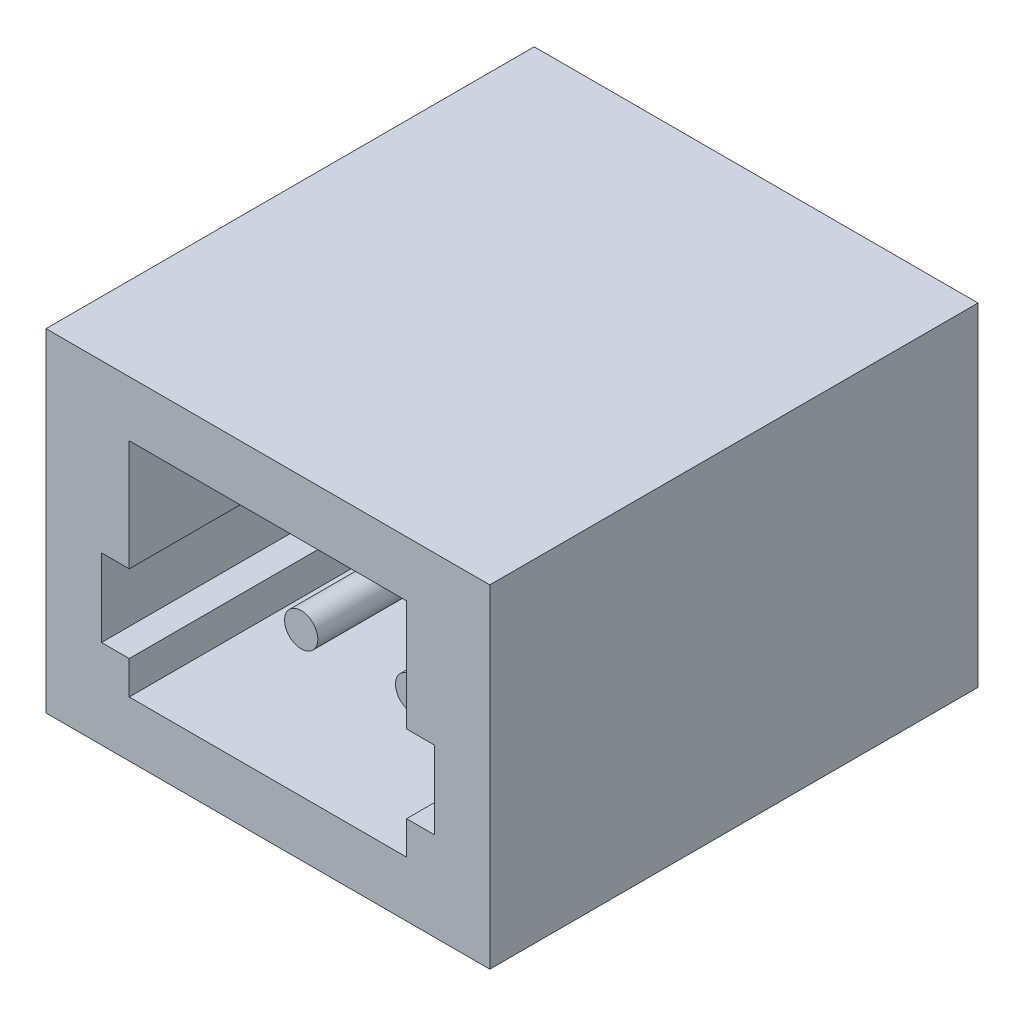
ISO-10303-21;
HEADER;
FILE_DESCRIPTION(('STEP AP214'),'2;1');
FILE_NAME('part.step','',(''),(''),'','','');
FILE_SCHEMA(('AUTOMOTIVE_DESIGN { 1 0 10303 214 1 1 1 1 }'));
ENDSEC;
DATA;
#1=APPLICATION_CONTEXT('core data for automotive mechanical design processes');
#2=APPLICATION_PROTOCOL_DEFINITION('international standard','automotive_design',2000,#1);
#3=PRODUCT_CONTEXT('',#1,'mechanical');
#4=PRODUCT('Part','Part','',(#3));
#5=PRODUCT_RELATED_PRODUCT_CATEGORY('part','',(#4));
#6=PRODUCT_DEFINITION_FORMATION('','',#4);
#7=PRODUCT_DEFINITION_CONTEXT('part definition',#1,'design');
#8=PRODUCT_DEFINITION('design','',#6,#7);
#9=PRODUCT_DEFINITION_SHAPE('','',#8);
#10=(LENGTH_UNIT() NAMED_UNIT(*) SI_UNIT(.MILLI.,.METRE.));
#11=(NAMED_UNIT(*) PLANE_ANGLE_UNIT() SI_UNIT($,.RADIAN.));
#12=(NAMED_UNIT(*) SI_UNIT($,.STERADIAN.) SOLID_ANGLE_UNIT());
#13=UNCERTAINTY_MEASURE_WITH_UNIT(LENGTH_MEASURE(1.E-05),#10,'distance_accuracy_value','');
#14=(GEOMETRIC_REPRESENTATION_CONTEXT(3) GLOBAL_UNCERTAINTY_ASSIGNED_CONTEXT((#13)) GLOBAL_UNIT_ASSIGNED_CONTEXT((#10,
#11,#12)) REPRESENTATION_CONTEXT('',''));
#15=CARTESIAN_POINT('',(0.,0.,0.));
#16=DIRECTION('',(0.,0.,1.));
#17=DIRECTION('',(1.,0.,0.));
#18=AXIS2_PLACEMENT_3D('',#15,#16,#17);
#19=CARTESIAN_POINT('',(48.87919066397,14.25110304722,-10.15));
#20=DIRECTION('',(1.,0.,0.));
#21=DIRECTION('',(0.,0.,-1.));
#22=AXIS2_PLACEMENT_3D('',#19,#20,#21);
#23=PLANE('',#22);
#24=DIRECTION('',(0.,-1.,0.));
#25=VECTOR('',#24,1.);
#26=CARTESIAN_POINT('',(48.87919066397,14.25110304722,-5.75));
#27=LINE('',#26,#25);
#28=CARTESIAN_POINT('',(48.87919066397,14.25110304722,-5.75));
#29=VERTEX_POINT('',#28);
#30=CARTESIAN_POINT('',(48.87919066397,11.25110304722,-5.75));
#31=VERTEX_POINT('',#30);
#32=EDGE_CURVE('E11',#29,#31,#27,.T.);
#33=ORIENTED_EDGE('',*,*,#32,.T.);
#34=DIRECTION('',(0.,0.,-1.));
#35=VECTOR('',#34,1.);
#36=CARTESIAN_POINT('',(48.87919066397,11.25110304722,-5.75));
#37=LINE('',#36,#35);
#38=CARTESIAN_POINT('',(48.87919066397,11.25110304722,-10.15));
#39=VERTEX_POINT('',#38);
#40=EDGE_CURVE('E27',#31,#39,#37,.T.);
#41=ORIENTED_EDGE('',*,*,#40,.T.);
#42=DIRECTION('',(0.,-1.,0.));
#43=VECTOR('',#42,1.);
#44=CARTESIAN_POINT('',(48.87919066397,14.25110304722,-10.15));
#45=LINE('',#44,#43);
#46=CARTESIAN_POINT('',(48.87919066397,14.25110304722,-10.15));
#47=VERTEX_POINT('',#46);
#48=EDGE_CURVE('E430',#47,#39,#45,.T.);
#49=ORIENTED_EDGE('',*,*,#48,.F.);
#50=DIRECTION('',(0.,0.,-1.));
#51=VECTOR('',#50,1.);
#52=CARTESIAN_POINT('',(48.87919066397,14.25110304722,-5.75));
#53=LINE('',#52,#51);
#54=EDGE_CURVE('E498',#29,#47,#53,.T.);
#55=ORIENTED_EDGE('',*,*,#54,.F.);
#56=EDGE_LOOP('',(#33,#41,#49,#55));
#57=FACE_BOUND('',#56,.T.);
#58=ADVANCED_FACE('F17',(#57),#23,.T.);
#59=CARTESIAN_POINT('',(44.87919066397,14.25110304722,-10.15));
#60=DIRECTION('',(0.,1.,0.));
#61=DIRECTION('',(0.,0.,1.));
#62=AXIS2_PLACEMENT_3D('',#59,#60,#61);
#63=PLANE('',#62);
#64=ORIENTED_EDGE('',*,*,#54,.T.);
#65=DIRECTION('',(1.,0.,0.));
#66=VECTOR('',#65,1.);
#67=CARTESIAN_POINT('',(44.87919066397,14.25110304722,-10.15));
#68=LINE('',#67,#66);
#69=CARTESIAN_POINT('',(44.87919066397,14.25110304722,-10.15));
#70=VERTEX_POINT('',#69);
#71=EDGE_CURVE('E427',#70,#47,#68,.T.);
#72=ORIENTED_EDGE('',*,*,#71,.F.);
#73=DIRECTION('',(0.,0.,-1.));
#74=VECTOR('',#73,1.);
#75=CARTESIAN_POINT('',(44.87919066397,14.25110304722,-5.75));
#76=LINE('',#75,#74);
#77=CARTESIAN_POINT('',(44.87919066397,14.25110304722,-5.75));
#78=VERTEX_POINT('',#77);
#79=EDGE_CURVE('E494',#78,#70,#76,.T.);
#80=ORIENTED_EDGE('',*,*,#79,.F.);
#81=DIRECTION('',(1.,0.,0.));
#82=VECTOR('',#81,1.);
#83=CARTESIAN_POINT('',(44.87919066397,14.25110304722,-5.75));
#84=LINE('',#83,#82);
#85=EDGE_CURVE('E493',#78,#29,#84,.T.);
#86=ORIENTED_EDGE('',*,*,#85,.T.);
#87=EDGE_LOOP('',(#64,#72,#80,#86));
#88=FACE_BOUND('',#87,.T.);
#89=ADVANCED_FACE('F188',(#88),#63,.T.);
#90=CARTESIAN_POINT('',(49.99345093786,14.29155013054,-5.75));
#91=DIRECTION('',(0.,0.,1.));
#92=DIRECTION('',(1.,0.,0.));
#93=AXIS2_PLACEMENT_3D('',#90,#91,#92);
#94=PLANE('',#93);
#95=DIRECTION('',(-1.,0.,0.));
#96=VECTOR('',#95,1.);
#97=CARTESIAN_POINT('',(48.87919066397,11.25110304722,-5.75));
#98=LINE('',#97,#96);
#99=CARTESIAN_POINT('',(44.87919066397,11.25110304722,-5.75));
#100=VERTEX_POINT('',#99);
#101=EDGE_CURVE('E426',#31,#100,#98,.T.);
#102=ORIENTED_EDGE('',*,*,#101,.F.);
#103=ORIENTED_EDGE('',*,*,#32,.F.);
#104=ORIENTED_EDGE('',*,*,#85,.F.);
#105=DIRECTION('',(0.,1.,0.));
#106=VECTOR('',#105,1.);
#107=CARTESIAN_POINT('',(44.87919066397,11.25110304722,-5.75));
#108=LINE('',#107,#106);
#109=EDGE_CURVE('E490',#100,#78,#108,.T.);
#110=ORIENTED_EDGE('',*,*,#109,.F.);
#111=EDGE_LOOP('',(#102,#103,#104,#110));
#112=FACE_BOUND('',#111,.T.);
#113=DIRECTION('',(-1.,0.,0.));
#114=VECTOR('',#113,1.);
#115=CARTESIAN_POINT('',(48.12919066397,13.75110304722,-5.75));
#116=LINE('',#115,#114);
#117=CARTESIAN_POINT('',(48.12919066397,13.75110304722,-5.75));
#118=VERTEX_POINT('',#117);
#119=CARTESIAN_POINT('',(45.62919066397,13.75110304722,-5.75));
#120=VERTEX_POINT('',#119);
#121=EDGE_CURVE('E436',#118,#120,#116,.T.);
#122=ORIENTED_EDGE('',*,*,#121,.F.);
#123=DIRECTION('',(0.,1.,0.));
#124=VECTOR('',#123,1.);
#125=CARTESIAN_POINT('',(48.12919066397,12.75110304722,-5.75));
#126=LINE('',#125,#124);
#127=CARTESIAN_POINT('',(48.12919066397,12.75110304722,-5.75));
#128=VERTEX_POINT('',#127);
#129=EDGE_CURVE('E442',#128,#118,#126,.T.);
#130=ORIENTED_EDGE('',*,*,#129,.F.);
#131=DIRECTION('',(-1.,0.,0.));
#132=VECTOR('',#131,1.);
#133=CARTESIAN_POINT('',(48.37919066397,12.75110304722,-5.75));
#134=LINE('',#133,#132);
#135=CARTESIAN_POINT('',(48.37919066397,12.75110304722,-5.75));
#136=VERTEX_POINT('',#135);
#137=EDGE_CURVE('E449',#136,#128,#134,.T.);
#138=ORIENTED_EDGE('',*,*,#137,.F.);
#139=DIRECTION('',(0.,1.,0.));
#140=VECTOR('',#139,1.);
#141=CARTESIAN_POINT('',(48.37919066397,12.05110304722,-5.75));
#142=LINE('',#141,#140);
#143=CARTESIAN_POINT('',(48.37919066397,12.05110304722,-5.75));
#144=VERTEX_POINT('',#143);
#145=EDGE_CURVE('E456',#144,#136,#142,.T.);
#146=ORIENTED_EDGE('',*,*,#145,.F.);
#147=DIRECTION('',(1.,0.,0.));
#148=VECTOR('',#147,1.);
#149=CARTESIAN_POINT('',(48.12919066397,12.05110304722,-5.75));
#150=LINE('',#149,#148);
#151=CARTESIAN_POINT('',(48.12919066397,12.05110304722,-5.75));
#152=VERTEX_POINT('',#151);
#153=EDGE_CURVE('E463',#152,#144,#150,.T.);
#154=ORIENTED_EDGE('',*,*,#153,.F.);
#155=DIRECTION('',(0.,1.,0.));
#156=VECTOR('',#155,1.);
#157=CARTESIAN_POINT('',(48.12919066397,11.75110304722,-5.75));
#158=LINE('',#157,#156);
#159=CARTESIAN_POINT('',(48.12919066397,11.75110304722,-5.75));
#160=VERTEX_POINT('',#159);
#161=EDGE_CURVE('E470',#160,#152,#158,.T.);
#162=ORIENTED_EDGE('',*,*,#161,.F.);
#163=DIRECTION('',(1.,0.,0.));
#164=VECTOR('',#163,1.);
#165=CARTESIAN_POINT('',(45.62919066397,11.75110304722,-5.75));
#166=LINE('',#165,#164);
#167=CARTESIAN_POINT('',(45.62919066397,11.75110304722,-5.75));
#168=VERTEX_POINT('',#167);
#169=EDGE_CURVE('E476',#168,#160,#166,.T.);
#170=ORIENTED_EDGE('',*,*,#169,.F.);
#171=DIRECTION('',(0.,-1.,0.));
#172=VECTOR('',#171,1.);
#173=CARTESIAN_POINT('',(45.62919066397,12.05110304722,-5.75));
#174=LINE('',#173,#172);
#175=CARTESIAN_POINT('',(45.62919066397,12.05110304722,-5.75));
#176=VERTEX_POINT('',#175);
#177=EDGE_CURVE('E401',#176,#168,#174,.T.);
#178=ORIENTED_EDGE('',*,*,#177,.F.);
#179=DIRECTION('',(1.,0.,0.));
#180=VECTOR('',#179,1.);
#181=CARTESIAN_POINT('',(45.37919066397,12.05110304722,-5.75));
#182=LINE('',#181,#180);
#183=CARTESIAN_POINT('',(45.37919066397,12.05110304722,-5.75));
#184=VERTEX_POINT('',#183);
#185=EDGE_CURVE('E399',#184,#176,#182,.T.);
#186=ORIENTED_EDGE('',*,*,#185,.F.);
#187=DIRECTION('',(0.,-1.,0.));
#188=VECTOR('',#187,1.);
#189=CARTESIAN_POINT('',(45.37919066397,12.75110304722,-5.75));
#190=LINE('',#189,#188);
#191=CARTESIAN_POINT('',(45.37919066397,12.75110304722,-5.75));
#192=VERTEX_POINT('',#191);
#193=EDGE_CURVE('E147',#192,#184,#190,.T.);
#194=ORIENTED_EDGE('',*,*,#193,.F.);
#195=DIRECTION('',(-1.,0.,0.));
#196=VECTOR('',#195,1.);
#197=CARTESIAN_POINT('',(45.62919066397,12.75110304722,-5.75));
#198=LINE('',#197,#196);
#199=CARTESIAN_POINT('',(45.62919066397,12.75110304722,-5.75));
#200=VERTEX_POINT('',#199);
#201=EDGE_CURVE('E145',#200,#192,#198,.T.);
#202=ORIENTED_EDGE('',*,*,#201,.F.);
#203=DIRECTION('',(0.,-1.,0.));
#204=VECTOR('',#203,1.);
#205=CARTESIAN_POINT('',(45.62919066397,13.75110304722,-5.75));
#206=LINE('',#205,#204);
#207=EDGE_CURVE('E414',#120,#200,#206,.T.);
#208=ORIENTED_EDGE('',*,*,#207,.F.);
#209=EDGE_LOOP('',(#122,#130,#138,#146,#154,#162,#170,#178,#186,#194,#202,#208));
#210=FACE_BOUND('',#209,.T.);
#211=ADVANCED_FACE('F194',(#112,#210),#94,.T.);
#212=CARTESIAN_POINT('',(44.87919066397,11.29638630085,-10.15));
#213=DIRECTION('',(-1.,0.,0.));
#214=DIRECTION('',(0.,0.,1.));
#215=AXIS2_PLACEMENT_3D('',#212,#213,#214);
#216=PLANE('',#215);
#217=ORIENTED_EDGE('',*,*,#109,.T.);
#218=ORIENTED_EDGE('',*,*,#79,.T.);
#219=DIRECTION('',(0.,1.,0.));
#220=VECTOR('',#219,1.);
#221=CARTESIAN_POINT('',(44.87919066397,11.25110304722,-10.15));
#222=LINE('',#221,#220);
#223=CARTESIAN_POINT('',(44.87919066397,11.25110304722,-10.15));
#224=VERTEX_POINT('',#223);
#225=EDGE_CURVE('E419',#224,#70,#222,.T.);
#226=ORIENTED_EDGE('',*,*,#225,.F.);
#227=DIRECTION('',(0.,0.,-1.));
#228=VECTOR('',#227,1.);
#229=CARTESIAN_POINT('',(44.87919066397,11.25110304722,-5.75));
#230=LINE('',#229,#228);
#231=EDGE_CURVE('E423',#100,#224,#230,.T.);
#232=ORIENTED_EDGE('',*,*,#231,.F.);
#233=EDGE_LOOP('',(#217,#218,#226,#232));
#234=FACE_BOUND('',#233,.T.);
#235=ADVANCED_FACE('F200',(#234),#216,.T.);
#236=CARTESIAN_POINT('',(48.92156706221,11.25110304722,-10.15));
#237=DIRECTION('',(0.,-1.,0.));
#238=DIRECTION('',(0.,0.,-1.));
#239=AXIS2_PLACEMENT_3D('',#236,#237,#238);
#240=PLANE('',#239);
#241=ORIENTED_EDGE('',*,*,#101,.T.);
#242=ORIENTED_EDGE('',*,*,#231,.T.);
#243=DIRECTION('',(-1.,0.,0.));
#244=VECTOR('',#243,1.);
#245=CARTESIAN_POINT('',(48.87919066397,11.25110304722,-10.15));
#246=LINE('',#245,#244);
#247=EDGE_CURVE('E422',#39,#224,#246,.T.);
#248=ORIENTED_EDGE('',*,*,#247,.F.);
#249=ORIENTED_EDGE('',*,*,#40,.F.);
#250=EDGE_LOOP('',(#241,#242,#248,#249));
#251=FACE_BOUND('',#250,.T.);
#252=ADVANCED_FACE('F204',(#251),#240,.T.);
#253=CARTESIAN_POINT('',(49.99345093786,14.29155013054,-10.15));
#254=DIRECTION('',(0.,0.,1.));
#255=DIRECTION('',(1.,0.,0.));
#256=AXIS2_PLACEMENT_3D('',#253,#254,#255);
#257=PLANE('',#256);
#258=ORIENTED_EDGE('',*,*,#71,.T.);
#259=ORIENTED_EDGE('',*,*,#48,.T.);
#260=ORIENTED_EDGE('',*,*,#247,.T.);
#261=ORIENTED_EDGE('',*,*,#225,.T.);
#262=EDGE_LOOP('',(#258,#259,#260,#261));
#263=FACE_BOUND('',#262,.T.);
#264=ADVANCED_FACE('F208',(#263),#257,.F.);
#265=CARTESIAN_POINT('',(45.62919066397,13.75110304722,-5.75));
#266=DIRECTION('',(-1.,0.,0.));
#267=DIRECTION('',(0.,-1.,0.));
#268=AXIS2_PLACEMENT_3D('',#265,#266,#267);
#269=PLANE('',#268);
#270=DIRECTION('',(0.,0.,-1.));
#271=VECTOR('',#270,1.);
#272=CARTESIAN_POINT('',(45.62919066397,12.75110304722,-5.75));
#273=LINE('',#272,#271);
#274=CARTESIAN_POINT('',(45.62919066397,12.75110304722,-9.35));
#275=VERTEX_POINT('',#274);
#276=EDGE_CURVE('E417',#200,#275,#273,.T.);
#277=ORIENTED_EDGE('',*,*,#276,.T.);
#278=DIRECTION('',(0.,-1.,0.));
#279=VECTOR('',#278,1.);
#280=CARTESIAN_POINT('',(45.62919066397,13.75110304722,-9.35));
#281=LINE('',#280,#279);
#282=CARTESIAN_POINT('',(45.62919066397,13.75110304722,-9.35));
#283=VERTEX_POINT('',#282);
#284=EDGE_CURVE('E152',#283,#275,#281,.T.);
#285=ORIENTED_EDGE('',*,*,#284,.F.);
#286=DIRECTION('',(0.,0.,-1.));
#287=VECTOR('',#286,1.);
#288=CARTESIAN_POINT('',(45.62919066397,13.75110304722,-5.75));
#289=LINE('',#288,#287);
#290=EDGE_CURVE('E418',#120,#283,#289,.T.);
#291=ORIENTED_EDGE('',*,*,#290,.F.);
#292=ORIENTED_EDGE('',*,*,#207,.T.);
#293=EDGE_LOOP('',(#277,#285,#291,#292));
#294=FACE_BOUND('',#293,.T.);
#295=ADVANCED_FACE('F211',(#294),#269,.F.);
#296=CARTESIAN_POINT('',(48.12919066397,13.75110304722,-5.75));
#297=DIRECTION('',(0.,1.,0.));
#298=DIRECTION('',(-1.,0.,0.));
#299=AXIS2_PLACEMENT_3D('',#296,#297,#298);
#300=PLANE('',#299);
#301=ORIENTED_EDGE('',*,*,#290,.T.);
#302=DIRECTION('',(-1.,0.,0.));
#303=VECTOR('',#302,1.);
#304=CARTESIAN_POINT('',(48.12919066397,13.75110304722,-9.35));
#305=LINE('',#304,#303);
#306=CARTESIAN_POINT('',(48.12919066397,13.75110304722,-9.35));
#307=VERTEX_POINT('',#306);
#308=EDGE_CURVE('E433',#307,#283,#305,.T.);
#309=ORIENTED_EDGE('',*,*,#308,.F.);
#310=DIRECTION('',(0.,0.,-1.));
#311=VECTOR('',#310,1.);
#312=CARTESIAN_POINT('',(48.12919066397,13.75110304722,-5.75));
#313=LINE('',#312,#311);
#314=EDGE_CURVE('E439',#118,#307,#313,.T.);
#315=ORIENTED_EDGE('',*,*,#314,.F.);
#316=ORIENTED_EDGE('',*,*,#121,.T.);
#317=EDGE_LOOP('',(#301,#309,#315,#316));
#318=FACE_BOUND('',#317,.T.);
#319=ADVANCED_FACE('F215',(#318),#300,.F.);
#320=CARTESIAN_POINT('',(48.12919066397,12.75110304722,-5.75));
#321=DIRECTION('',(1.,0.,0.));
#322=DIRECTION('',(0.,1.,0.));
#323=AXIS2_PLACEMENT_3D('',#320,#321,#322);
#324=PLANE('',#323);
#325=ORIENTED_EDGE('',*,*,#314,.T.);
#326=DIRECTION('',(0.,1.,0.));
#327=VECTOR('',#326,1.);
#328=CARTESIAN_POINT('',(48.12919066397,12.75110304722,-9.35));
#329=LINE('',#328,#327);
#330=CARTESIAN_POINT('',(48.12919066397,12.75110304722,-9.35));
#331=VERTEX_POINT('',#330);
#332=EDGE_CURVE('E438',#331,#307,#329,.T.);
#333=ORIENTED_EDGE('',*,*,#332,.F.);
#334=DIRECTION('',(0.,0.,-1.));
#335=VECTOR('',#334,1.);
#336=CARTESIAN_POINT('',(48.12919066397,12.75110304722,-5.75));
#337=LINE('',#336,#335);
#338=EDGE_CURVE('E446',#128,#331,#337,.T.);
#339=ORIENTED_EDGE('',*,*,#338,.F.);
#340=ORIENTED_EDGE('',*,*,#129,.T.);
#341=EDGE_LOOP('',(#325,#333,#339,#340));
#342=FACE_BOUND('',#341,.T.);
#343=ADVANCED_FACE('F219',(#342),#324,.F.);
#344=CARTESIAN_POINT('',(48.37919066397,12.75110304722,-5.75));
#345=DIRECTION('',(0.,1.,0.));
#346=DIRECTION('',(-1.,0.,0.));
#347=AXIS2_PLACEMENT_3D('',#344,#345,#346);
#348=PLANE('',#347);
#349=ORIENTED_EDGE('',*,*,#338,.T.);
#350=DIRECTION('',(-1.,0.,0.));
#351=VECTOR('',#350,1.);
#352=CARTESIAN_POINT('',(48.37919066397,12.75110304722,-9.35));
#353=LINE('',#352,#351);
#354=CARTESIAN_POINT('',(48.37919066397,12.75110304722,-9.35));
#355=VERTEX_POINT('',#354);
#356=EDGE_CURVE('E445',#355,#331,#353,.T.);
#357=ORIENTED_EDGE('',*,*,#356,.F.);
#358=DIRECTION('',(0.,0.,-1.));
#359=VECTOR('',#358,1.);
#360=CARTESIAN_POINT('',(48.37919066397,12.75110304722,-5.75));
#361=LINE('',#360,#359);
#362=EDGE_CURVE('E453',#136,#355,#361,.T.);
#363=ORIENTED_EDGE('',*,*,#362,.F.);
#364=ORIENTED_EDGE('',*,*,#137,.T.);
#365=EDGE_LOOP('',(#349,#357,#363,#364));
#366=FACE_BOUND('',#365,.T.);
#367=ADVANCED_FACE('F223',(#366),#348,.F.);
#368=CARTESIAN_POINT('',(48.37919066397,12.05110304722,-5.75));
#369=DIRECTION('',(1.,0.,0.));
#370=DIRECTION('',(0.,1.,0.));
#371=AXIS2_PLACEMENT_3D('',#368,#369,#370);
#372=PLANE('',#371);
#373=ORIENTED_EDGE('',*,*,#362,.T.);
#374=DIRECTION('',(0.,1.,0.));
#375=VECTOR('',#374,1.);
#376=CARTESIAN_POINT('',(48.37919066397,12.05110304722,-9.35));
#377=LINE('',#376,#375);
#378=CARTESIAN_POINT('',(48.37919066397,12.05110304722,-9.35));
#379=VERTEX_POINT('',#378);
#380=EDGE_CURVE('E452',#379,#355,#377,.T.);
#381=ORIENTED_EDGE('',*,*,#380,.F.);
#382=DIRECTION('',(0.,0.,-1.));
#383=VECTOR('',#382,1.);
#384=CARTESIAN_POINT('',(48.37919066397,12.05110304722,-5.75));
#385=LINE('',#384,#383);
#386=EDGE_CURVE('E460',#144,#379,#385,.T.);
#387=ORIENTED_EDGE('',*,*,#386,.F.);
#388=ORIENTED_EDGE('',*,*,#145,.T.);
#389=EDGE_LOOP('',(#373,#381,#387,#388));
#390=FACE_BOUND('',#389,.T.);
#391=ADVANCED_FACE('F227',(#390),#372,.F.);
#392=CARTESIAN_POINT('',(48.12919066397,12.05110304722,-5.75));
#393=DIRECTION('',(0.,-1.,0.));
#394=DIRECTION('',(1.,0.,0.));
#395=AXIS2_PLACEMENT_3D('',#392,#393,#394);
#396=PLANE('',#395);
#397=ORIENTED_EDGE('',*,*,#386,.T.);
#398=DIRECTION('',(1.,0.,0.));
#399=VECTOR('',#398,1.);
#400=CARTESIAN_POINT('',(48.12919066397,12.05110304722,-9.35));
#401=LINE('',#400,#399);
#402=CARTESIAN_POINT('',(48.12919066397,12.05110304722,-9.35));
#403=VERTEX_POINT('',#402);
#404=EDGE_CURVE('E459',#403,#379,#401,.T.);
#405=ORIENTED_EDGE('',*,*,#404,.F.);
#406=DIRECTION('',(0.,0.,-1.));
#407=VECTOR('',#406,1.);
#408=CARTESIAN_POINT('',(48.12919066397,12.05110304722,-5.75));
#409=LINE('',#408,#407);
#410=EDGE_CURVE('E467',#152,#403,#409,.T.);
#411=ORIENTED_EDGE('',*,*,#410,.F.);
#412=ORIENTED_EDGE('',*,*,#153,.T.);
#413=EDGE_LOOP('',(#397,#405,#411,#412));
#414=FACE_BOUND('',#413,.T.);
#415=ADVANCED_FACE('F231',(#414),#396,.F.);
#416=CARTESIAN_POINT('',(48.12919066397,11.75110304722,-5.75));
#417=DIRECTION('',(1.,0.,0.));
#418=DIRECTION('',(0.,1.,0.));
#419=AXIS2_PLACEMENT_3D('',#416,#417,#418);
#420=PLANE('',#419);
#421=ORIENTED_EDGE('',*,*,#410,.T.);
#422=DIRECTION('',(0.,1.,0.));
#423=VECTOR('',#422,1.);
#424=CARTESIAN_POINT('',(48.12919066397,11.75110304722,-9.35));
#425=LINE('',#424,#423);
#426=CARTESIAN_POINT('',(48.12919066397,11.75110304722,-9.35));
#427=VERTEX_POINT('',#426);
#428=EDGE_CURVE('E466',#427,#403,#425,.T.);
#429=ORIENTED_EDGE('',*,*,#428,.F.);
#430=DIRECTION('',(0.,0.,-1.));
#431=VECTOR('',#430,1.);
#432=CARTESIAN_POINT('',(48.12919066397,11.75110304722,-5.75));
#433=LINE('',#432,#431);
#434=EDGE_CURVE('E473',#160,#427,#433,.T.);
#435=ORIENTED_EDGE('',*,*,#434,.F.);
#436=ORIENTED_EDGE('',*,*,#161,.T.);
#437=EDGE_LOOP('',(#421,#429,#435,#436));
#438=FACE_BOUND('',#437,.T.);
#439=ADVANCED_FACE('F235',(#438),#420,.F.);
#440=CARTESIAN_POINT('',(45.62919066397,11.75110304722,-5.75));
#441=DIRECTION('',(0.,-1.,0.));
#442=DIRECTION('',(1.,0.,0.));
#443=AXIS2_PLACEMENT_3D('',#440,#441,#442);
#444=PLANE('',#443);
#445=ORIENTED_EDGE('',*,*,#434,.T.);
#446=DIRECTION('',(1.,0.,0.));
#447=VECTOR('',#446,1.);
#448=CARTESIAN_POINT('',(45.62919066397,11.75110304722,-9.35));
#449=LINE('',#448,#447);
#450=CARTESIAN_POINT('',(45.62919066397,11.75110304722,-9.35));
#451=VERTEX_POINT('',#450);
#452=EDGE_CURVE('E407',#451,#427,#449,.T.);
#453=ORIENTED_EDGE('',*,*,#452,.F.);
#454=DIRECTION('',(0.,0.,-1.));
#455=VECTOR('',#454,1.);
#456=CARTESIAN_POINT('',(45.62919066397,11.75110304722,-5.75));
#457=LINE('',#456,#455);
#458=EDGE_CURVE('E478',#168,#451,#457,.T.);
#459=ORIENTED_EDGE('',*,*,#458,.F.);
#460=ORIENTED_EDGE('',*,*,#169,.T.);
#461=EDGE_LOOP('',(#445,#453,#459,#460));
#462=FACE_BOUND('',#461,.T.);
#463=ADVANCED_FACE('F239',(#462),#444,.F.);
#464=CARTESIAN_POINT('',(45.62919066397,12.05110304722,-5.75));
#465=DIRECTION('',(-1.,0.,0.));
#466=DIRECTION('',(0.,-1.,0.));
#467=AXIS2_PLACEMENT_3D('',#464,#465,#466);
#468=PLANE('',#467);
#469=ORIENTED_EDGE('',*,*,#458,.T.);
#470=DIRECTION('',(0.,-1.,0.));
#471=VECTOR('',#470,1.);
#472=CARTESIAN_POINT('',(45.62919066397,12.05110304722,-9.35));
#473=LINE('',#472,#471);
#474=CARTESIAN_POINT('',(45.62919066397,12.05110304722,-9.35));
#475=VERTEX_POINT('',#474);
#476=EDGE_CURVE('E405',#475,#451,#473,.T.);
#477=ORIENTED_EDGE('',*,*,#476,.F.);
#478=DIRECTION('',(0.,0.,-1.));
#479=VECTOR('',#478,1.);
#480=CARTESIAN_POINT('',(45.62919066397,12.05110304722,-5.75));
#481=LINE('',#480,#479);
#482=EDGE_CURVE('E397',#176,#475,#481,.T.);
#483=ORIENTED_EDGE('',*,*,#482,.F.);
#484=ORIENTED_EDGE('',*,*,#177,.T.);
#485=EDGE_LOOP('',(#469,#477,#483,#484));
#486=FACE_BOUND('',#485,.T.);
#487=ADVANCED_FACE('F243',(#486),#468,.F.);
#488=CARTESIAN_POINT('',(45.37919066397,12.05110304722,-5.75));
#489=DIRECTION('',(0.,-1.,0.));
#490=DIRECTION('',(1.,0.,0.));
#491=AXIS2_PLACEMENT_3D('',#488,#489,#490);
#492=PLANE('',#491);
#493=ORIENTED_EDGE('',*,*,#482,.T.);
#494=DIRECTION('',(1.,0.,0.));
#495=VECTOR('',#494,1.);
#496=CARTESIAN_POINT('',(45.37919066397,12.05110304722,-9.35));
#497=LINE('',#496,#495);
#498=CARTESIAN_POINT('',(45.37919066397,12.05110304722,-9.35));
#499=VERTEX_POINT('',#498);
#500=EDGE_CURVE('E126',#499,#475,#497,.T.);
#501=ORIENTED_EDGE('',*,*,#500,.F.);
#502=DIRECTION('',(0.,0.,-1.));
#503=VECTOR('',#502,1.);
#504=CARTESIAN_POINT('',(45.37919066397,12.05110304722,-5.75));
#505=LINE('',#504,#503);
#506=EDGE_CURVE('E136',#184,#499,#505,.T.);
#507=ORIENTED_EDGE('',*,*,#506,.F.);
#508=ORIENTED_EDGE('',*,*,#185,.T.);
#509=EDGE_LOOP('',(#493,#501,#507,#508));
#510=FACE_BOUND('',#509,.T.);
#511=ADVANCED_FACE('F247',(#510),#492,.F.);
#512=CARTESIAN_POINT('',(45.37919066397,12.75110304722,-5.75));
#513=DIRECTION('',(-1.,0.,0.));
#514=DIRECTION('',(0.,-1.,0.));
#515=AXIS2_PLACEMENT_3D('',#512,#513,#514);
#516=PLANE('',#515);
#517=ORIENTED_EDGE('',*,*,#506,.T.);
#518=DIRECTION('',(0.,-1.,0.));
#519=VECTOR('',#518,1.);
#520=CARTESIAN_POINT('',(45.37919066397,12.75110304722,-9.35));
#521=LINE('',#520,#519);
#522=CARTESIAN_POINT('',(45.37919066397,12.75110304722,-9.35));
#523=VERTEX_POINT('',#522);
#524=EDGE_CURVE('E132',#523,#499,#521,.T.);
#525=ORIENTED_EDGE('',*,*,#524,.F.);
#526=DIRECTION('',(0.,0.,-1.));
#527=VECTOR('',#526,1.);
#528=CARTESIAN_POINT('',(45.37919066397,12.75110304722,-5.75));
#529=LINE('',#528,#527);
#530=EDGE_CURVE('E135',#192,#523,#529,.T.);
#531=ORIENTED_EDGE('',*,*,#530,.F.);
#532=ORIENTED_EDGE('',*,*,#193,.T.);
#533=EDGE_LOOP('',(#517,#525,#531,#532));
#534=FACE_BOUND('',#533,.T.);
#535=ADVANCED_FACE('F134',(#534),#516,.F.);
#536=CARTESIAN_POINT('',(45.62919066397,12.75110304722,-5.75));
#537=DIRECTION('',(0.,1.,0.));
#538=DIRECTION('',(-1.,0.,0.));
#539=AXIS2_PLACEMENT_3D('',#536,#537,#538);
#540=PLANE('',#539);
#541=ORIENTED_EDGE('',*,*,#530,.T.);
#542=DIRECTION('',(-1.,0.,0.));
#543=VECTOR('',#542,1.);
#544=CARTESIAN_POINT('',(45.62919066397,12.75110304722,-9.35));
#545=LINE('',#544,#543);
#546=EDGE_CURVE('E139',#275,#523,#545,.T.);
#547=ORIENTED_EDGE('',*,*,#546,.F.);
#548=ORIENTED_EDGE('',*,*,#276,.F.);
#549=ORIENTED_EDGE('',*,*,#201,.T.);
#550=EDGE_LOOP('',(#541,#547,#548,#549));
#551=FACE_BOUND('',#550,.T.);
#552=ADVANCED_FACE('F143',(#551),#540,.F.);
#553=CARTESIAN_POINT('',(0.,0.,-9.35));
#554=DIRECTION('',(0.,0.,1.));
#555=DIRECTION('',(1.,0.,0.));
#556=AXIS2_PLACEMENT_3D('',#553,#554,#555);
#557=PLANE('',#556);
#558=ORIENTED_EDGE('',*,*,#546,.T.);
#559=ORIENTED_EDGE('',*,*,#524,.T.);
#560=ORIENTED_EDGE('',*,*,#500,.T.);
#561=ORIENTED_EDGE('',*,*,#476,.T.);
#562=ORIENTED_EDGE('',*,*,#452,.T.);
#563=ORIENTED_EDGE('',*,*,#428,.T.);
#564=ORIENTED_EDGE('',*,*,#404,.T.);
#565=ORIENTED_EDGE('',*,*,#380,.T.);
#566=ORIENTED_EDGE('',*,*,#356,.T.);
#567=ORIENTED_EDGE('',*,*,#332,.T.);
#568=ORIENTED_EDGE('',*,*,#308,.T.);
#569=ORIENTED_EDGE('',*,*,#284,.T.);
#570=EDGE_LOOP('',(#558,#559,#560,#561,#562,#563,#564,#565,#566,#567,#568,#569));
#571=FACE_BOUND('',#570,.T.);
#572=CARTESIAN_POINT('',(46.37919066397,12.25110304722,-9.35));
#573=DIRECTION('',(0.,0.,1.));
#574=DIRECTION('',(-1.,0.,0.));
#575=AXIS2_PLACEMENT_3D('',#572,#573,#574);
#576=CIRCLE('',#575,0.15);
#577=CARTESIAN_POINT('',(46.22919066397,12.25110304722,-9.35));
#578=VERTEX_POINT('',#577);
#579=EDGE_CURVE('E157',#578,#578,#576,.T.);
#580=ORIENTED_EDGE('',*,*,#579,.F.);
#581=EDGE_LOOP('',(#580));
#582=FACE_BOUND('',#581,.T.);
#583=CARTESIAN_POINT('',(47.37919066397,12.25110304722,-9.35));
#584=DIRECTION('',(0.,0.,1.));
#585=DIRECTION('',(-1.,0.,0.));
#586=AXIS2_PLACEMENT_3D('',#583,#584,#585);
#587=CIRCLE('',#586,0.15);
#588=CARTESIAN_POINT('',(47.22919066397,12.25110304722,-9.35));
#589=VERTEX_POINT('',#588);
#590=EDGE_CURVE('E161',#589,#589,#587,.T.);
#591=ORIENTED_EDGE('',*,*,#590,.F.);
#592=EDGE_LOOP('',(#591));
#593=FACE_BOUND('',#592,.T.);
#594=ADVANCED_FACE('F149',(#571,#582,#593),#557,.T.);
#595=CARTESIAN_POINT('',(46.37919066397,12.25110304722,-9.35));
#596=DIRECTION('',(0.,0.,1.));
#597=DIRECTION('',(1.,0.,0.));
#598=AXIS2_PLACEMENT_3D('',#595,#596,#597);
#599=CYLINDRICAL_SURFACE('',#598,0.15);
#600=CARTESIAN_POINT('',(46.37919066397,12.25110304722,-6.55));
#601=DIRECTION('',(0.,0.,1.));
#602=DIRECTION('',(1.,0.,0.));
#603=AXIS2_PLACEMENT_3D('',#600,#601,#602);
#604=CIRCLE('',#603,0.15);
#605=CARTESIAN_POINT('',(46.52919066397,12.25110304722,-6.55));
#606=VERTEX_POINT('',#605);
#607=EDGE_CURVE('E160',#606,#606,#604,.T.);
#608=ORIENTED_EDGE('',*,*,#607,.F.);
#609=EDGE_LOOP('',(#608));
#610=FACE_BOUND('',#609,.T.);
#611=ORIENTED_EDGE('',*,*,#579,.T.);
#612=EDGE_LOOP('',(#611));
#613=FACE_BOUND('',#612,.T.);
#614=ADVANCED_FACE('F176',(#610,#613),#599,.T.);
#615=CARTESIAN_POINT('',(0.,0.,-6.55));
#616=DIRECTION('',(0.,0.,1.));
#617=DIRECTION('',(1.,0.,0.));
#618=AXIS2_PLACEMENT_3D('',#615,#616,#617);
#619=PLANE('',#618);
#620=ORIENTED_EDGE('',*,*,#607,.T.);
#621=EDGE_LOOP('',(#620));
#622=FACE_BOUND('',#621,.T.);
#623=ADVANCED_FACE('F183',(#622),#619,.T.);
#624=CARTESIAN_POINT('',(0.,0.,-6.55));
#625=DIRECTION('',(0.,0.,1.));
#626=DIRECTION('',(1.,0.,0.));
#627=AXIS2_PLACEMENT_3D('',#624,#625,#626);
#628=PLANE('',#627);
#629=CARTESIAN_POINT('',(47.37919066397,12.25110304722,-6.55));
#630=DIRECTION('',(0.,0.,1.));
#631=DIRECTION('',(-1.,0.,0.));
#632=AXIS2_PLACEMENT_3D('',#629,#630,#631);
#633=CIRCLE('',#632,0.15);
#634=CARTESIAN_POINT('',(47.22919066397,12.25110304722,-6.55));
#635=VERTEX_POINT('',#634);
#636=EDGE_CURVE('E21',#635,#635,#633,.T.);
#637=ORIENTED_EDGE('',*,*,#636,.T.);
#638=EDGE_LOOP('',(#637));
#639=FACE_BOUND('',#638,.T.);
#640=ADVANCED_FACE('F169',(#639),#628,.T.);
#641=CARTESIAN_POINT('',(47.37919066397,12.25110304722,-9.35));
#642=DIRECTION('',(0.,0.,1.));
#643=DIRECTION('',(1.,0.,0.));
#644=AXIS2_PLACEMENT_3D('',#641,#642,#643);
#645=CYLINDRICAL_SURFACE('',#644,0.15);
#646=ORIENTED_EDGE('',*,*,#636,.F.);
#647=EDGE_LOOP('',(#646));
#648=FACE_BOUND('',#647,.T.);
#649=ORIENTED_EDGE('',*,*,#590,.T.);
#650=EDGE_LOOP('',(#649));
#651=FACE_BOUND('',#650,.T.);
#652=ADVANCED_FACE('F19',(#648,#651),#645,.T.);
#653=CLOSED_SHELL('',(#58,#89,#211,#235,#252,#264,#295,#319,#343,#367,#391,#415,#439,#463,#487,
#511,#535,#552,#594,#614,#623,#640,#652));
#654=MANIFOLD_SOLID_BREP('B1',#653);
#655=ADVANCED_BREP_SHAPE_REPRESENTATION('',(#18,#654),#14);
#656=SHAPE_DEFINITION_REPRESENTATION(#9,#655);
ENDSEC;
END-ISO-10303-21;
